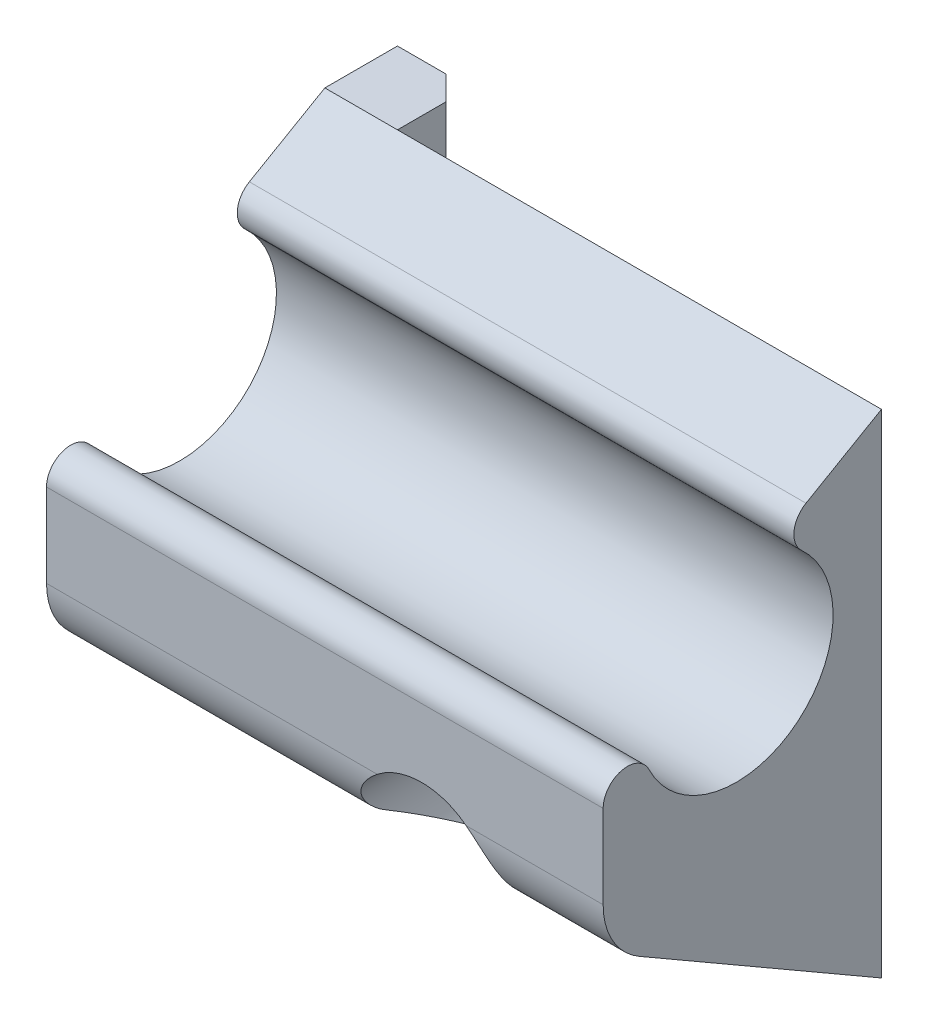
ISO-10303-21;
HEADER;
FILE_DESCRIPTION(('STEP AP214'),'2;1');
FILE_NAME('part.step','',(''),(''),'','','');
FILE_SCHEMA(('AUTOMOTIVE_DESIGN { 1 0 10303 214 1 1 1 1 }'));
ENDSEC;
DATA;
#1=APPLICATION_CONTEXT('core data for automotive mechanical design processes');
#2=APPLICATION_PROTOCOL_DEFINITION('international standard','automotive_design',2000,#1);
#3=PRODUCT_CONTEXT('',#1,'mechanical');
#4=PRODUCT('Part','Part','',(#3));
#5=PRODUCT_RELATED_PRODUCT_CATEGORY('part','',(#4));
#6=PRODUCT_DEFINITION_FORMATION('','',#4);
#7=PRODUCT_DEFINITION_CONTEXT('part definition',#1,'design');
#8=PRODUCT_DEFINITION('design','',#6,#7);
#9=PRODUCT_DEFINITION_SHAPE('','',#8);
#10=(LENGTH_UNIT() NAMED_UNIT(*) SI_UNIT(.MILLI.,.METRE.));
#11=(NAMED_UNIT(*) PLANE_ANGLE_UNIT() SI_UNIT($,.RADIAN.));
#12=(NAMED_UNIT(*) SI_UNIT($,.STERADIAN.) SOLID_ANGLE_UNIT());
#13=UNCERTAINTY_MEASURE_WITH_UNIT(LENGTH_MEASURE(1.E-05),#10,'distance_accuracy_value','');
#14=(GEOMETRIC_REPRESENTATION_CONTEXT(3) GLOBAL_UNCERTAINTY_ASSIGNED_CONTEXT((#13)) GLOBAL_UNIT_ASSIGNED_CONTEXT((#10,
#11,#12)) REPRESENTATION_CONTEXT('',''));
#15=CARTESIAN_POINT('',(0.,0.,0.));
#16=DIRECTION('',(0.,0.,1.));
#17=DIRECTION('',(1.,0.,0.));
#18=AXIS2_PLACEMENT_3D('',#15,#16,#17);
#19=CARTESIAN_POINT('',(0.,0.,0.));
#20=DIRECTION('',(0.,0.,1.));
#21=DIRECTION('',(1.,0.,0.));
#22=AXIS2_PLACEMENT_3D('',#19,#20,#21);
#23=CYLINDRICAL_SURFACE('',#22,1.6);
#24=CARTESIAN_POINT('',(0.,0.,0.));
#25=DIRECTION('',(0.,0.,1.));
#26=DIRECTION('',(1.,0.,0.));
#27=AXIS2_PLACEMENT_3D('',#24,#25,#26);
#28=CIRCLE('',#27,1.6);
#29=CARTESIAN_POINT('',(1.6,0.,0.));
#30=VERTEX_POINT('',#29);
#31=EDGE_CURVE('E186',#30,#30,#28,.T.);
#32=ORIENTED_EDGE('',*,*,#31,.F.);
#33=EDGE_LOOP('',(#32));
#34=FACE_BOUND('',#33,.T.);
#35=CARTESIAN_POINT('',(0.,0.,5.5));
#36=DIRECTION('',(0.,0.,1.));
#37=DIRECTION('',(1.,0.,0.));
#38=AXIS2_PLACEMENT_3D('',#35,#36,#37);
#39=CIRCLE('',#38,1.6);
#40=CARTESIAN_POINT('',(1.6,0.,5.5));
#41=VERTEX_POINT('',#40);
#42=EDGE_CURVE('E177',#41,#41,#39,.F.);
#43=ORIENTED_EDGE('',*,*,#42,.F.);
#44=EDGE_LOOP('',(#43));
#45=FACE_BOUND('',#44,.T.);
#46=ADVANCED_FACE('F35',(#34,#45),#23,.F.);
#47=CARTESIAN_POINT('',(-15.5,-6.,0.));
#48=DIRECTION('',(0.,-0.866025403784436,0.500000000000004));
#49=DIRECTION('',(0.,-0.500000000000004,-0.866025403784436));
#50=AXIS2_PLACEMENT_3D('',#47,#48,#49);
#51=PLANE('',#50);
#52=DIRECTION('',(0.,-0.500000000000004,-0.866025403784436));
#53=VECTOR('',#52,1.);
#54=CARTESIAN_POINT('',(7.5,-6.,0.));
#55=LINE('',#54,#53);
#56=CARTESIAN_POINT('',(7.5,-0.226497308103673,10.));
#57=VERTEX_POINT('',#56);
#58=CARTESIAN_POINT('',(7.5,-6.,0.));
#59=VERTEX_POINT('',#58);
#60=EDGE_CURVE('E207',#57,#59,#55,.T.);
#61=ORIENTED_EDGE('',*,*,#60,.F.);
#62=DIRECTION('',(1.,0.,0.));
#63=VECTOR('',#62,1.);
#64=CARTESIAN_POINT('',(-15.5,-0.226497308103674,10.));
#65=LINE('',#64,#63);
#66=CARTESIAN_POINT('',(2.99143760914745,-0.226497308103674,10.));
#67=VERTEX_POINT('',#66);
#68=EDGE_CURVE('E251',#57,#67,#65,.F.);
#69=ORIENTED_EDGE('',*,*,#68,.T.);
#70=CARTESIAN_POINT('',(0.,0.,10.3923048454132));
#71=DIRECTION('',(0.,-0.866025403784436,0.500000000000004));
#72=DIRECTION('',(0.,0.500000000000004,0.866025403784436));
#73=AXIS2_PLACEMENT_3D('',#70,#71,#72);
#74=ELLIPSE('',#73,5.99999999999995,3.);
#75=CARTESIAN_POINT('',(1.01083353386309,-2.82457351945702,5.5));
#76=VERTEX_POINT('',#75);
#77=EDGE_CURVE('E182',#76,#67,#74,.T.);
#78=ORIENTED_EDGE('',*,*,#77,.F.);
#79=DIRECTION('',(-1.,0.,0.));
#80=VECTOR('',#79,1.);
#81=CARTESIAN_POINT('',(-15.5,-2.82457351945702,5.5));
#82=LINE('',#81,#80);
#83=CARTESIAN_POINT('',(-1.01083353386309,-2.82457351945702,5.5));
#84=VERTEX_POINT('',#83);
#85=EDGE_CURVE('E179',#76,#84,#82,.T.);
#86=ORIENTED_EDGE('',*,*,#85,.T.);
#87=CARTESIAN_POINT('',(-2.99143760914745,-0.226497308103675,10.));
#88=VERTEX_POINT('',#87);
#89=EDGE_CURVE('E185',#88,#84,#74,.T.);
#90=ORIENTED_EDGE('',*,*,#89,.F.);
#91=DIRECTION('',(1.,0.,0.));
#92=VECTOR('',#91,1.);
#93=CARTESIAN_POINT('',(-15.5,-0.226497308103674,10.));
#94=LINE('',#93,#92);
#95=CARTESIAN_POINT('',(-15.5,-0.226497308103673,10.));
#96=VERTEX_POINT('',#95);
#97=EDGE_CURVE('E249',#88,#96,#94,.F.);
#98=ORIENTED_EDGE('',*,*,#97,.T.);
#99=DIRECTION('',(0.,-0.500000000000004,-0.866025403784436));
#100=VECTOR('',#99,1.);
#101=CARTESIAN_POINT('',(-15.5,-6.,0.));
#102=LINE('',#101,#100);
#103=CARTESIAN_POINT('',(-15.5,-6.,0.));
#104=VERTEX_POINT('',#103);
#105=EDGE_CURVE('E222',#96,#104,#102,.T.);
#106=ORIENTED_EDGE('',*,*,#105,.T.);
#107=DIRECTION('',(1.,0.,0.));
#108=VECTOR('',#107,1.);
#109=CARTESIAN_POINT('',(-15.5,-6.,0.));
#110=LINE('',#109,#108);
#111=CARTESIAN_POINT('',(-12.5,-6.,0.));
#112=VERTEX_POINT('',#111);
#113=EDGE_CURVE('E225',#104,#112,#110,.T.);
#114=ORIENTED_EDGE('',*,*,#113,.T.);
#115=EDGE_CURVE('E229',#112,#59,#110,.T.);
#116=ORIENTED_EDGE('',*,*,#115,.T.);
#117=EDGE_LOOP('',(#61,#69,#78,#86,#90,#98,#106,#114,#116));
#118=FACE_BOUND('',#117,.T.);
#119=ADVANCED_FACE('F278',(#118),#51,.T.);
#120=CARTESIAN_POINT('',(-15.5,0.639528095680765,11.5));
#121=DIRECTION('',(0.,0.,1.));
#122=DIRECTION('',(1.,0.,0.));
#123=AXIS2_PLACEMENT_3D('',#120,#121,#122);
#124=PLANE('',#123);
#125=CARTESIAN_POINT('',(0.,0.,11.5));
#126=DIRECTION('',(0.,0.,1.));
#127=DIRECTION('',(1.,0.,0.));
#128=AXIS2_PLACEMENT_3D('',#125,#126,#127);
#129=CIRCLE('',#128,3.);
#130=CARTESIAN_POINT('',(1.83728427459152,2.37157890324964,11.5));
#131=VERTEX_POINT('',#130);
#132=CARTESIAN_POINT('',(-1.83728427459152,2.37157890324964,11.5));
#133=VERTEX_POINT('',#132);
#134=EDGE_CURVE('E166',#131,#133,#129,.T.);
#135=ORIENTED_EDGE('',*,*,#134,.F.);
#136=DIRECTION('',(1.,0.,0.));
#137=VECTOR('',#136,1.);
#138=CARTESIAN_POINT('',(-15.5,2.37157890324964,11.5));
#139=LINE('',#138,#137);
#140=CARTESIAN_POINT('',(7.5,2.37157890324964,11.5));
#141=VERTEX_POINT('',#140);
#142=EDGE_CURVE('E244',#131,#141,#139,.T.);
#143=ORIENTED_EDGE('',*,*,#142,.T.);
#144=DIRECTION('',(0.,-1.,0.));
#145=VECTOR('',#144,1.);
#146=CARTESIAN_POINT('',(7.5,0.639528095680765,11.5));
#147=LINE('',#146,#145);
#148=CARTESIAN_POINT('',(7.5,5.82055052822966,11.5));
#149=VERTEX_POINT('',#148);
#150=EDGE_CURVE('E204',#149,#141,#147,.T.);
#151=ORIENTED_EDGE('',*,*,#150,.F.);
#152=DIRECTION('',(1.,0.,0.));
#153=VECTOR('',#152,1.);
#154=CARTESIAN_POINT('',(-15.5,5.82055052822966,11.5));
#155=LINE('',#154,#153);
#156=CARTESIAN_POINT('',(-15.5,5.82055052822966,11.5));
#157=VERTEX_POINT('',#156);
#158=EDGE_CURVE('E230',#157,#149,#155,.T.);
#159=ORIENTED_EDGE('',*,*,#158,.F.);
#160=DIRECTION('',(0.,-1.,0.));
#161=VECTOR('',#160,1.);
#162=CARTESIAN_POINT('',(-15.5,0.639528095680765,11.5));
#163=LINE('',#162,#161);
#164=CARTESIAN_POINT('',(-15.5,2.37157890324964,11.5));
#165=VERTEX_POINT('',#164);
#166=EDGE_CURVE('E219',#157,#165,#163,.T.);
#167=ORIENTED_EDGE('',*,*,#166,.T.);
#168=DIRECTION('',(1.,0.,0.));
#169=VECTOR('',#168,1.);
#170=CARTESIAN_POINT('',(-15.5,2.37157890324964,11.5));
#171=LINE('',#170,#169);
#172=EDGE_CURVE('E228',#165,#133,#171,.T.);
#173=ORIENTED_EDGE('',*,*,#172,.T.);
#174=EDGE_LOOP('',(#135,#143,#151,#159,#167,#173));
#175=FACE_BOUND('',#174,.T.);
#176=ADVANCED_FACE('F289',(#175),#124,.T.);
#177=CARTESIAN_POINT('',(-15.5,5.82055052822966,10.5));
#178=DIRECTION('',(1.,0.,0.));
#179=DIRECTION('',(0.,0.,-1.));
#180=AXIS2_PLACEMENT_3D('',#177,#178,#179);
#181=CYLINDRICAL_SURFACE('',#180,1.);
#182=ORIENTED_EDGE('',*,*,#158,.T.);
#183=CARTESIAN_POINT('',(7.5,5.82055052822966,10.5));
#184=DIRECTION('',(1.,0.,0.));
#185=DIRECTION('',(0.,0.,-1.));
#186=AXIS2_PLACEMENT_3D('',#183,#184,#185);
#187=CIRCLE('',#186,1.);
#188=CARTESIAN_POINT('',(7.5,6.25644042258373,9.6));
#189=VERTEX_POINT('',#188);
#190=EDGE_CURVE('E201',#189,#149,#187,.T.);
#191=ORIENTED_EDGE('',*,*,#190,.F.);
#192=DIRECTION('',(1.,0.,0.));
#193=VECTOR('',#192,1.);
#194=CARTESIAN_POINT('',(-15.5,6.25644042258373,9.6));
#195=LINE('',#194,#193);
#196=CARTESIAN_POINT('',(-15.5,6.25644042258373,9.6));
#197=VERTEX_POINT('',#196);
#198=EDGE_CURVE('E232',#197,#189,#195,.T.);
#199=ORIENTED_EDGE('',*,*,#198,.F.);
#200=CARTESIAN_POINT('',(-15.5,5.82055052822966,10.5));
#201=DIRECTION('',(1.,0.,0.));
#202=DIRECTION('',(0.,0.,-1.));
#203=AXIS2_PLACEMENT_3D('',#200,#201,#202);
#204=CIRCLE('',#203,1.);
#205=EDGE_CURVE('E216',#197,#157,#204,.T.);
#206=ORIENTED_EDGE('',*,*,#205,.T.);
#207=EDGE_LOOP('',(#182,#191,#199,#206));
#208=FACE_BOUND('',#207,.T.);
#209=ADVANCED_FACE('F293',(#208),#181,.T.);
#210=CARTESIAN_POINT('',(-15.5,8.,6.));
#211=DIRECTION('',(1.,0.,0.));
#212=DIRECTION('',(0.,0.,-1.));
#213=AXIS2_PLACEMENT_3D('',#210,#211,#212);
#214=CYLINDRICAL_SURFACE('',#213,4.);
#215=ORIENTED_EDGE('',*,*,#198,.T.);
#216=CARTESIAN_POINT('',(7.5,8.,6.));
#217=DIRECTION('',(-1.,0.,0.));
#218=DIRECTION('',(0.,0.,-1.));
#219=AXIS2_PLACEMENT_3D('',#216,#217,#218);
#220=CIRCLE('',#219,4.);
#221=CARTESIAN_POINT('',(7.5,10.9471088873752,3.29545767162835));
#222=VERTEX_POINT('',#221);
#223=EDGE_CURVE('E198',#222,#189,#220,.T.);
#224=ORIENTED_EDGE('',*,*,#223,.F.);
#225=DIRECTION('',(1.,0.,0.));
#226=VECTOR('',#225,1.);
#227=CARTESIAN_POINT('',(-15.5,10.9471088873752,3.29545767162835));
#228=LINE('',#227,#226);
#229=CARTESIAN_POINT('',(-15.5,10.9471088873752,3.29545767162835));
#230=VERTEX_POINT('',#229);
#231=EDGE_CURVE('E234',#230,#222,#228,.T.);
#232=ORIENTED_EDGE('',*,*,#231,.F.);
#233=CARTESIAN_POINT('',(-15.5,8.,6.));
#234=DIRECTION('',(-1.,0.,0.));
#235=DIRECTION('',(0.,0.,-1.));
#236=AXIS2_PLACEMENT_3D('',#233,#234,#235);
#237=CIRCLE('',#236,4.);
#238=EDGE_CURVE('E213',#230,#197,#237,.T.);
#239=ORIENTED_EDGE('',*,*,#238,.T.);
#240=EDGE_LOOP('',(#215,#224,#232,#239));
#241=FACE_BOUND('',#240,.T.);
#242=ADVANCED_FACE('F297',(#241),#214,.F.);
#243=CARTESIAN_POINT('',(-15.5,11.683886109219,2.61932208953544));
#244=DIRECTION('',(1.,0.,0.));
#245=DIRECTION('',(0.,0.,-1.));
#246=AXIS2_PLACEMENT_3D('',#243,#244,#245);
#247=CYLINDRICAL_SURFACE('',#246,0.999999999999999);
#248=ORIENTED_EDGE('',*,*,#231,.T.);
#249=CARTESIAN_POINT('',(7.5,11.683886109219,2.61932208953544));
#250=DIRECTION('',(1.,0.,0.));
#251=DIRECTION('',(0.,0.,-1.));
#252=AXIS2_PLACEMENT_3D('',#249,#250,#251);
#253=CIRCLE('',#252,0.999999999999999);
#254=CARTESIAN_POINT('',(7.5,12.5499115130035,3.11932208953545));
#255=VERTEX_POINT('',#254);
#256=EDGE_CURVE('E195',#255,#222,#253,.T.);
#257=ORIENTED_EDGE('',*,*,#256,.F.);
#258=DIRECTION('',(1.,0.,0.));
#259=VECTOR('',#258,1.);
#260=CARTESIAN_POINT('',(-15.5,12.5499115130035,3.11932208953545));
#261=LINE('',#260,#259);
#262=CARTESIAN_POINT('',(-15.5,12.5499115130035,3.11932208953545));
#263=VERTEX_POINT('',#262);
#264=EDGE_CURVE('E236',#263,#255,#261,.T.);
#265=ORIENTED_EDGE('',*,*,#264,.F.);
#266=CARTESIAN_POINT('',(-15.5,11.683886109219,2.61932208953544));
#267=DIRECTION('',(1.,0.,0.));
#268=DIRECTION('',(0.,0.,-1.));
#269=AXIS2_PLACEMENT_3D('',#266,#267,#268);
#270=CIRCLE('',#269,0.999999999999999);
#271=EDGE_CURVE('E210',#263,#230,#270,.T.);
#272=ORIENTED_EDGE('',*,*,#271,.T.);
#273=EDGE_LOOP('',(#248,#257,#265,#272));
#274=FACE_BOUND('',#273,.T.);
#275=ADVANCED_FACE('F301',(#274),#247,.T.);
#276=CARTESIAN_POINT('',(-15.5,14.3508529610859,0.));
#277=DIRECTION('',(0.,0.866025403784436,0.500000000000004));
#278=DIRECTION('',(0.,-0.500000000000004,0.866025403784436));
#279=AXIS2_PLACEMENT_3D('',#276,#277,#278);
#280=PLANE('',#279);
#281=ORIENTED_EDGE('',*,*,#264,.T.);
#282=DIRECTION('',(0.,-0.500000000000004,0.866025403784436));
#283=VECTOR('',#282,1.);
#284=CARTESIAN_POINT('',(7.5,14.3508529610859,0.));
#285=LINE('',#284,#283);
#286=CARTESIAN_POINT('',(7.5,14.3508529610859,0.));
#287=VERTEX_POINT('',#286);
#288=EDGE_CURVE('E192',#287,#255,#285,.T.);
#289=ORIENTED_EDGE('',*,*,#288,.F.);
#290=DIRECTION('',(1.,0.,0.));
#291=VECTOR('',#290,1.);
#292=CARTESIAN_POINT('',(-15.5,14.3508529610859,0.));
#293=LINE('',#292,#291);
#294=CARTESIAN_POINT('',(-12.5,14.3508529610859,0.));
#295=VERTEX_POINT('',#294);
#296=EDGE_CURVE('E224',#295,#287,#293,.T.);
#297=ORIENTED_EDGE('',*,*,#296,.F.);
#298=CARTESIAN_POINT('',(-15.5,14.3508529610859,0.));
#299=VERTEX_POINT('',#298);
#300=EDGE_CURVE('E238',#299,#295,#293,.T.);
#301=ORIENTED_EDGE('',*,*,#300,.F.);
#302=DIRECTION('',(0.,-0.500000000000004,0.866025403784436));
#303=VECTOR('',#302,1.);
#304=CARTESIAN_POINT('',(-15.5,14.3508529610859,0.));
#305=LINE('',#304,#303);
#306=EDGE_CURVE('E165',#299,#263,#305,.T.);
#307=ORIENTED_EDGE('',*,*,#306,.T.);
#308=EDGE_LOOP('',(#281,#289,#297,#301,#307));
#309=FACE_BOUND('',#308,.T.);
#310=ADVANCED_FACE('F305',(#309),#280,.T.);
#311=CARTESIAN_POINT('',(-15.5,0.,0.));
#312=DIRECTION('',(0.,0.,-1.));
#313=DIRECTION('',(-1.,0.,0.));
#314=AXIS2_PLACEMENT_3D('',#311,#312,#313);
#315=PLANE('',#314);
#316=DIRECTION('',(0.,-1.,0.));
#317=VECTOR('',#316,1.);
#318=CARTESIAN_POINT('',(-12.5,14.3508529610859,0.));
#319=LINE('',#318,#317);
#320=EDGE_CURVE('E158',#295,#112,#319,.T.);
#321=ORIENTED_EDGE('',*,*,#320,.F.);
#322=ORIENTED_EDGE('',*,*,#296,.T.);
#323=DIRECTION('',(0.,1.,0.));
#324=VECTOR('',#323,1.);
#325=CARTESIAN_POINT('',(7.5,0.,0.));
#326=LINE('',#325,#324);
#327=EDGE_CURVE('E189',#59,#287,#326,.T.);
#328=ORIENTED_EDGE('',*,*,#327,.F.);
#329=ORIENTED_EDGE('',*,*,#115,.F.);
#330=EDGE_LOOP('',(#321,#322,#328,#329));
#331=FACE_BOUND('',#330,.T.);
#332=ORIENTED_EDGE('',*,*,#31,.T.);
#333=EDGE_LOOP('',(#332));
#334=FACE_BOUND('',#333,.T.);
#335=ADVANCED_FACE('F286',(#331,#334),#315,.T.);
#336=CARTESIAN_POINT('',(-15.5,5.82055052822966,10.5));
#337=DIRECTION('',(1.,0.,0.));
#338=DIRECTION('',(0.,0.,-1.));
#339=AXIS2_PLACEMENT_3D('',#336,#337,#338);
#340=PLANE('',#339);
#341=ORIENTED_EDGE('',*,*,#105,.F.);
#342=CARTESIAN_POINT('',(-15.5,2.37157890324964,8.5));
#343=DIRECTION('',(1.,0.,0.));
#344=DIRECTION('',(0.,0.,-1.));
#345=AXIS2_PLACEMENT_3D('',#342,#343,#344);
#346=CIRCLE('',#345,3.);
#347=EDGE_CURVE('E327',#96,#165,#346,.F.);
#348=ORIENTED_EDGE('',*,*,#347,.T.);
#349=ORIENTED_EDGE('',*,*,#166,.F.);
#350=ORIENTED_EDGE('',*,*,#205,.F.);
#351=ORIENTED_EDGE('',*,*,#238,.F.);
#352=ORIENTED_EDGE('',*,*,#271,.F.);
#353=ORIENTED_EDGE('',*,*,#306,.F.);
#354=DIRECTION('',(0.,0.,1.));
#355=VECTOR('',#354,1.);
#356=CARTESIAN_POINT('',(-15.5,14.3508529610859,-3.));
#357=LINE('',#356,#355);
#358=CARTESIAN_POINT('',(-15.5,14.3508529610859,-3.));
#359=VERTEX_POINT('',#358);
#360=EDGE_CURVE('E145',#359,#299,#357,.T.);
#361=ORIENTED_EDGE('',*,*,#360,.F.);
#362=DIRECTION('',(0.,1.,0.));
#363=VECTOR('',#362,1.);
#364=CARTESIAN_POINT('',(-15.5,14.3508529610859,-3.));
#365=LINE('',#364,#363);
#366=CARTESIAN_POINT('',(-15.5,-6.,-3.));
#367=VERTEX_POINT('',#366);
#368=EDGE_CURVE('E151',#367,#359,#365,.T.);
#369=ORIENTED_EDGE('',*,*,#368,.F.);
#370=DIRECTION('',(0.,0.,1.));
#371=VECTOR('',#370,1.);
#372=CARTESIAN_POINT('',(-15.5,-6.,-3.));
#373=LINE('',#372,#371);
#374=EDGE_CURVE('E335',#367,#104,#373,.T.);
#375=ORIENTED_EDGE('',*,*,#374,.T.);
#376=EDGE_LOOP('',(#341,#348,#349,#350,#351,#352,#353,#361,#369,#375));
#377=FACE_BOUND('',#376,.T.);
#378=ADVANCED_FACE('F162',(#377),#340,.F.);
#379=CARTESIAN_POINT('',(7.5,5.82055052822966,10.5));
#380=DIRECTION('',(1.,0.,0.));
#381=DIRECTION('',(0.,0.,-1.));
#382=AXIS2_PLACEMENT_3D('',#379,#380,#381);
#383=PLANE('',#382);
#384=ORIENTED_EDGE('',*,*,#150,.T.);
#385=CARTESIAN_POINT('',(7.5,2.37157890324964,8.5));
#386=DIRECTION('',(1.,0.,0.));
#387=DIRECTION('',(0.,0.,-1.));
#388=AXIS2_PLACEMENT_3D('',#385,#386,#387);
#389=CIRCLE('',#388,3.);
#390=EDGE_CURVE('E247',#141,#57,#389,.T.);
#391=ORIENTED_EDGE('',*,*,#390,.T.);
#392=ORIENTED_EDGE('',*,*,#60,.T.);
#393=ORIENTED_EDGE('',*,*,#327,.T.);
#394=ORIENTED_EDGE('',*,*,#288,.T.);
#395=ORIENTED_EDGE('',*,*,#256,.T.);
#396=ORIENTED_EDGE('',*,*,#223,.T.);
#397=ORIENTED_EDGE('',*,*,#190,.T.);
#398=EDGE_LOOP('',(#384,#391,#392,#393,#394,#395,#396,#397));
#399=FACE_BOUND('',#398,.T.);
#400=ADVANCED_FACE('F280',(#399),#383,.T.);
#401=CARTESIAN_POINT('',(0.,0.,5.5));
#402=DIRECTION('',(0.,0.,1.));
#403=DIRECTION('',(1.,0.,0.));
#404=AXIS2_PLACEMENT_3D('',#401,#402,#403);
#405=PLANE('',#404);
#406=CARTESIAN_POINT('',(0.,0.,5.5));
#407=DIRECTION('',(0.,0.,1.));
#408=DIRECTION('',(1.,0.,0.));
#409=AXIS2_PLACEMENT_3D('',#406,#407,#408);
#410=CIRCLE('',#409,3.);
#411=EDGE_CURVE('E170',#76,#84,#410,.T.);
#412=ORIENTED_EDGE('',*,*,#411,.T.);
#413=ORIENTED_EDGE('',*,*,#85,.F.);
#414=EDGE_LOOP('',(#412,#413));
#415=FACE_BOUND('',#414,.T.);
#416=ORIENTED_EDGE('',*,*,#42,.T.);
#417=EDGE_LOOP('',(#416));
#418=FACE_BOUND('',#417,.T.);
#419=ADVANCED_FACE('F272',(#415,#418),#405,.T.);
#420=CARTESIAN_POINT('',(0.,0.,5.5));
#421=DIRECTION('',(0.,0.,1.));
#422=DIRECTION('',(1.,0.,0.));
#423=AXIS2_PLACEMENT_3D('',#420,#421,#422);
#424=CYLINDRICAL_SURFACE('',#423,3.);
#425=ORIENTED_EDGE('',*,*,#77,.T.);
#426=CARTESIAN_POINT('',(2.99143760914745,-0.226497308103674,10.));
#427=CARTESIAN_POINT('',(2.99422923616977,-0.189567189196157,10.0639786175245));
#428=CARTESIAN_POINT('',(2.99652301154581,-0.15024689129727,10.1266128569779));
#429=CARTESIAN_POINT('',(2.99954088164408,-0.0670497068759151,10.2488711213678));
#430=CARTESIAN_POINT('',(3.0002640252498,-0.0231700762313066,10.3084933009817));
#431=CARTESIAN_POINT('',(2.99955986337934,0.0691411892420781,10.4246605089501));
#432=CARTESIAN_POINT('',(2.99812017517404,0.117597535583782,10.4811858833411));
#433=CARTESIAN_POINT('',(2.99245910324519,0.21849755569298,10.5903983568328));
#434=CARTESIAN_POINT('',(2.9882382473366,0.270940471211989,10.6430861821239));
#435=CARTESIAN_POINT('',(2.9763822949261,0.379676048864135,10.7445220456627));
#436=CARTESIAN_POINT('',(2.96872942979378,0.435987437743417,10.7932480008701));
#437=CARTESIAN_POINT('',(2.94942634895196,0.551652264177339,10.8860771392092));
#438=CARTESIAN_POINT('',(2.93777664076882,0.611005314682699,10.9301809083468));
#439=CARTESIAN_POINT('',(2.91001566089294,0.731874146758373,11.0133104935569));
#440=CARTESIAN_POINT('',(2.89391966042945,0.793381907432635,11.0523530303585));
#441=CARTESIAN_POINT('',(2.85684807087343,0.91795397486434,11.1252966121419));
#442=CARTESIAN_POINT('',(2.83587313427711,0.98101807247408,11.1591983436411));
#443=CARTESIAN_POINT('',(2.79106057374119,1.10168680927888,11.2187228635581));
#444=CARTESIAN_POINT('',(2.76769616245734,1.15922942288927,11.2448292781957));
#445=CARTESIAN_POINT('',(2.71667797213912,1.27421265621233,11.2927887349323));
#446=CARTESIAN_POINT('',(2.68902277533709,1.33165323584267,11.3146403657583));
#447=CARTESIAN_POINT('',(2.62941858625115,1.44578829950255,11.3542183856138));
#448=CARTESIAN_POINT('',(2.59746608413031,1.50248213162307,11.3719413698864));
#449=CARTESIAN_POINT('',(2.52939710599776,1.61445127105591,11.4034715325361));
#450=CARTESIAN_POINT('',(2.49327906662891,1.6697260362041,11.4172772339574));
#451=CARTESIAN_POINT('',(2.38249732101313,1.82746847004316,11.452142482643));
#452=CARTESIAN_POINT('',(2.30254590927922,1.92734564947988,11.4684499333043));
#453=CARTESIAN_POINT('',(2.13002842676145,2.11645018140153,11.4906517412486));
#454=CARTESIAN_POINT('',(2.03747924193484,2.20569149479593,11.4965598924496));
#455=CARTESIAN_POINT('',(1.90612468233448,2.31703201825292,11.4996383037789));
#456=CARTESIAN_POINT('',(1.87199392027949,2.34469641870988,11.499999619069));
#457=CARTESIAN_POINT('',(1.83728427459152,2.37157890324964,11.5));
#458=B_SPLINE_CURVE_WITH_KNOTS('',3,(#426,#427,#428,#429,#430,#431,#432,#433,#434,#435,#436,
#437,#438,#439,#440,#441,#442,#443,#444,#445,#446,#447,#448,#449,#450,#451,#452,#453,#454,#455,
#456,#457),.UNSPECIFIED.,.F.,.F.,(4,2,2,2,2,2,2,2,2,2,2,2,2,2,2,4),(0.,0.221740863446923,
0.443615967565261,0.666766209927441,0.889874114632203,1.11415070119715,1.3383988192492,
1.56188611146114,1.78534353223135,1.98718433879193,2.18909198048115,2.39116554382969,
2.5933151952123,2.9785198045682,3.36321308175857,3.49496160368047),.UNSPECIFIED.);
#459=EDGE_CURVE('E259',#67,#131,#458,.T.);
#460=ORIENTED_EDGE('',*,*,#459,.T.);
#461=ORIENTED_EDGE('',*,*,#134,.T.);
#462=CARTESIAN_POINT('',(-1.83728427459152,2.37157890324964,11.5));
#463=CARTESIAN_POINT('',(-1.89219043618027,2.3290541911072,11.4999998346668));
#464=CARTESIAN_POINT('',(-1.94562109069457,2.28459919078027,11.4990957357539));
#465=CARTESIAN_POINT('',(-2.04925716872512,2.19211251262725,11.4949852190443));
#466=CARTESIAN_POINT('',(-2.09946044841179,2.14407850220249,11.4917772877648));
#467=CARTESIAN_POINT('',(-2.19645696719701,2.04460788266249,11.4825479011047));
#468=CARTESIAN_POINT('',(-2.24323820152373,1.99316039932583,11.4765170432073));
#469=CARTESIAN_POINT('',(-2.33288888660752,1.88744018230503,11.4611588519524));
#470=CARTESIAN_POINT('',(-2.37575920951104,1.83316808278042,11.4518322558278));
#471=CARTESIAN_POINT('',(-2.45752177181632,1.72202460702019,11.4293869157853));
#472=CARTESIAN_POINT('',(-2.49639349149017,1.66514179843486,11.4162498161241));
#473=CARTESIAN_POINT('',(-2.56969987794159,1.54962070805179,11.3858194533779));
#474=CARTESIAN_POINT('',(-2.60413299203642,1.49098182074649,11.3685247419339));
#475=CARTESIAN_POINT('',(-2.66829816964429,1.37283900204245,11.3295532291737));
#476=CARTESIAN_POINT('',(-2.69804416958919,1.3133382323606,11.3078898727363));
#477=CARTESIAN_POINT('',(-2.75292304938768,1.19404215064144,11.2599911713636));
#478=CARTESIAN_POINT('',(-2.77805436920719,1.13424674598907,11.2337542861275));
#479=CARTESIAN_POINT('',(-2.84317800785876,0.964475397909273,11.1523432989337));
#480=CARTESIAN_POINT('',(-2.87766847502356,0.855004444696211,11.0915154083426));
#481=CARTESIAN_POINT('',(-2.93253667218059,0.642164988151751,10.9546276344451));
#482=CARTESIAN_POINT('',(-2.95289554870056,0.538804804859413,10.8785475762928));
#483=CARTESIAN_POINT('',(-2.98237991473662,0.340119842402259,10.7114096772572));
#484=CARTESIAN_POINT('',(-2.99130170086561,0.244968199849285,10.620112113702));
#485=CARTESIAN_POINT('',(-3.00056137293529,0.0674047923555131,10.425644420897));
#486=CARTESIAN_POINT('',(-3.00090616553143,-0.0150171700472797,10.3224839115881));
#487=CARTESIAN_POINT('',(-2.99791343138883,-0.114466605833432,10.1796980935986));
#488=CARTESIAN_POINT('',(-2.99691258044757,-0.13796425373105,10.1443829516342));
#489=CARTESIAN_POINT('',(-2.99447522900718,-0.183395556056176,10.072861418066));
#490=CARTESIAN_POINT('',(-2.99303949091065,-0.205331865220966,10.0366566872566));
#491=CARTESIAN_POINT('',(-2.99143760914745,-0.226497308103674,10.));
#492=B_SPLINE_CURVE_WITH_KNOTS('',3,(#462,#463,#464,#465,#466,#467,#468,#469,#470,#471,#472,
#473,#474,#475,#476,#477,#478,#479,#480,#481,#482,#483,#484,#485,#486,#487,#488,#489,#490,#491),
.UNSPECIFIED.,.F.,.F.,(4,2,2,2,2,2,2,2,2,2,2,2,2,2,4),(0.,0.208319969521023,0.416776918384908,
0.625933184470167,0.835042693396891,1.04517673442845,1.25538408478239,1.46495411495027,
1.67459486223873,2.06225195218985,2.45042524071018,2.84542028975325,3.24009725728063,
3.36736015196778,3.49440122024488),.UNSPECIFIED.);
#493=EDGE_CURVE('E253',#133,#88,#492,.T.);
#494=ORIENTED_EDGE('',*,*,#493,.T.);
#495=ORIENTED_EDGE('',*,*,#89,.T.);
#496=ORIENTED_EDGE('',*,*,#411,.F.);
#497=EDGE_LOOP('',(#425,#460,#461,#494,#495,#496));
#498=FACE_BOUND('',#497,.T.);
#499=ADVANCED_FACE('F267',(#498),#424,.F.);
#500=CARTESIAN_POINT('',(-15.5,14.3508529610859,-3.));
#501=DIRECTION('',(0.,-1.,0.));
#502=DIRECTION('',(0.,0.,-1.));
#503=AXIS2_PLACEMENT_3D('',#500,#501,#502);
#504=PLANE('',#503);
#505=DIRECTION('',(0.,0.,1.));
#506=VECTOR('',#505,1.);
#507=CARTESIAN_POINT('',(-12.5,14.3508529610859,-3.));
#508=LINE('',#507,#506);
#509=CARTESIAN_POINT('',(-12.5,14.3508529610859,-2.));
#510=VERTEX_POINT('',#509);
#511=EDGE_CURVE('E167',#510,#295,#508,.T.);
#512=ORIENTED_EDGE('',*,*,#511,.F.);
#513=DIRECTION('',(0.707106781186547,0.,0.707106781186548));
#514=VECTOR('',#513,1.);
#515=CARTESIAN_POINT('',(-13.5,14.3508529610859,-3.));
#516=LINE('',#515,#514);
#517=CARTESIAN_POINT('',(-13.5,14.3508529610859,-3.));
#518=VERTEX_POINT('',#517);
#519=EDGE_CURVE('E11',#510,#518,#516,.F.);
#520=ORIENTED_EDGE('',*,*,#519,.T.);
#521=DIRECTION('',(1.,0.,0.));
#522=VECTOR('',#521,1.);
#523=CARTESIAN_POINT('',(-15.5,14.3508529610859,-3.));
#524=LINE('',#523,#522);
#525=EDGE_CURVE('E140',#359,#518,#524,.T.);
#526=ORIENTED_EDGE('',*,*,#525,.F.);
#527=ORIENTED_EDGE('',*,*,#360,.T.);
#528=ORIENTED_EDGE('',*,*,#300,.T.);
#529=EDGE_LOOP('',(#512,#520,#526,#527,#528));
#530=FACE_BOUND('',#529,.T.);
#531=ADVANCED_FACE('F142',(#530),#504,.F.);
#532=CARTESIAN_POINT('',(-12.5,14.3508529610859,-3.));
#533=DIRECTION('',(-1.,0.,0.));
#534=DIRECTION('',(0.,-1.,0.));
#535=AXIS2_PLACEMENT_3D('',#532,#533,#534);
#536=PLANE('',#535);
#537=DIRECTION('',(0.,0.,1.));
#538=VECTOR('',#537,1.);
#539=CARTESIAN_POINT('',(-12.5,-6.,-3.));
#540=LINE('',#539,#538);
#541=CARTESIAN_POINT('',(-12.5,-6.,-2.));
#542=VERTEX_POINT('',#541);
#543=EDGE_CURVE('E172',#542,#112,#540,.T.);
#544=ORIENTED_EDGE('',*,*,#543,.F.);
#545=DIRECTION('',(0.,1.,0.));
#546=VECTOR('',#545,1.);
#547=CARTESIAN_POINT('',(-12.5,14.3508529610859,-2.));
#548=LINE('',#547,#546);
#549=EDGE_CURVE('E43',#542,#510,#548,.T.);
#550=ORIENTED_EDGE('',*,*,#549,.T.);
#551=ORIENTED_EDGE('',*,*,#511,.T.);
#552=ORIENTED_EDGE('',*,*,#320,.T.);
#553=EDGE_LOOP('',(#544,#550,#551,#552));
#554=FACE_BOUND('',#553,.T.);
#555=ADVANCED_FACE('F347',(#554),#536,.F.);
#556=CARTESIAN_POINT('',(-15.5,-6.,-3.));
#557=DIRECTION('',(0.,1.,0.));
#558=DIRECTION('',(0.,0.,1.));
#559=AXIS2_PLACEMENT_3D('',#556,#557,#558);
#560=PLANE('',#559);
#561=DIRECTION('',(-1.,0.,0.));
#562=VECTOR('',#561,1.);
#563=CARTESIAN_POINT('',(-15.5,-6.,-3.));
#564=LINE('',#563,#562);
#565=CARTESIAN_POINT('',(-13.5,-6.,-3.));
#566=VERTEX_POINT('',#565);
#567=EDGE_CURVE('E150',#566,#367,#564,.T.);
#568=ORIENTED_EDGE('',*,*,#567,.F.);
#569=DIRECTION('',(-0.707106781186547,0.,-0.707106781186548));
#570=VECTOR('',#569,1.);
#571=CARTESIAN_POINT('',(-13.5,-6.,-3.));
#572=LINE('',#571,#570);
#573=EDGE_CURVE('E57',#566,#542,#572,.F.);
#574=ORIENTED_EDGE('',*,*,#573,.T.);
#575=ORIENTED_EDGE('',*,*,#543,.T.);
#576=ORIENTED_EDGE('',*,*,#113,.F.);
#577=ORIENTED_EDGE('',*,*,#374,.F.);
#578=EDGE_LOOP('',(#568,#574,#575,#576,#577));
#579=FACE_BOUND('',#578,.T.);
#580=ADVANCED_FACE('F321',(#579),#560,.F.);
#581=CARTESIAN_POINT('',(0.,0.,-3.));
#582=DIRECTION('',(0.,0.,1.));
#583=DIRECTION('',(1.,0.,0.));
#584=AXIS2_PLACEMENT_3D('',#581,#582,#583);
#585=PLANE('',#584);
#586=ORIENTED_EDGE('',*,*,#525,.T.);
#587=DIRECTION('',(0.,-1.,0.));
#588=VECTOR('',#587,1.);
#589=CARTESIAN_POINT('',(-13.5,0.,-3.));
#590=LINE('',#589,#588);
#591=EDGE_CURVE('E328',#518,#566,#590,.T.);
#592=ORIENTED_EDGE('',*,*,#591,.T.);
#593=ORIENTED_EDGE('',*,*,#567,.T.);
#594=ORIENTED_EDGE('',*,*,#368,.T.);
#595=EDGE_LOOP('',(#586,#592,#593,#594));
#596=FACE_BOUND('',#595,.T.);
#597=ADVANCED_FACE('F154',(#596),#585,.F.);
#598=CARTESIAN_POINT('',(-15.5,2.37157890324964,8.5));
#599=DIRECTION('',(1.,0.,0.));
#600=DIRECTION('',(0.,0.,-1.));
#601=AXIS2_PLACEMENT_3D('',#598,#599,#600);
#602=CYLINDRICAL_SURFACE('',#601,3.);
#603=ORIENTED_EDGE('',*,*,#459,.F.);
#604=ORIENTED_EDGE('',*,*,#68,.F.);
#605=ORIENTED_EDGE('',*,*,#390,.F.);
#606=ORIENTED_EDGE('',*,*,#142,.F.);
#607=EDGE_LOOP('',(#603,#604,#605,#606));
#608=FACE_BOUND('',#607,.T.);
#609=ADVANCED_FACE('F312',(#608),#602,.T.);
#610=CARTESIAN_POINT('',(-15.5,2.37157890324964,8.5));
#611=DIRECTION('',(1.,0.,0.));
#612=DIRECTION('',(0.,0.,-1.));
#613=AXIS2_PLACEMENT_3D('',#610,#611,#612);
#614=CYLINDRICAL_SURFACE('',#613,3.);
#615=ORIENTED_EDGE('',*,*,#347,.F.);
#616=ORIENTED_EDGE('',*,*,#97,.F.);
#617=ORIENTED_EDGE('',*,*,#493,.F.);
#618=ORIENTED_EDGE('',*,*,#172,.F.);
#619=EDGE_LOOP('',(#615,#616,#617,#618));
#620=FACE_BOUND('',#619,.T.);
#621=ADVANCED_FACE('F265',(#620),#614,.T.);
#622=CARTESIAN_POINT('',(-13.5,0.,-3.));
#623=DIRECTION('',(-0.707106781186548,0.,0.707106781186547));
#624=DIRECTION('',(0.,-1.,0.));
#625=AXIS2_PLACEMENT_3D('',#622,#623,#624);
#626=PLANE('',#625);
#627=ORIENTED_EDGE('',*,*,#519,.F.);
#628=ORIENTED_EDGE('',*,*,#549,.F.);
#629=ORIENTED_EDGE('',*,*,#573,.F.);
#630=ORIENTED_EDGE('',*,*,#591,.F.);
#631=EDGE_LOOP('',(#627,#628,#629,#630));
#632=FACE_BOUND('',#631,.T.);
#633=ADVANCED_FACE('F37',(#632),#626,.F.);
#634=CLOSED_SHELL('',(#46,#119,#176,#209,#242,#275,#310,#335,#378,#400,#419,#499,#531,#555,#580,
#597,#609,#621,#633));
#635=MANIFOLD_SOLID_BREP('B2',#634);
#636=ADVANCED_BREP_SHAPE_REPRESENTATION('',(#18,#635),#14);
#637=SHAPE_DEFINITION_REPRESENTATION(#9,#636);
ENDSEC;
END-ISO-10303-21;
